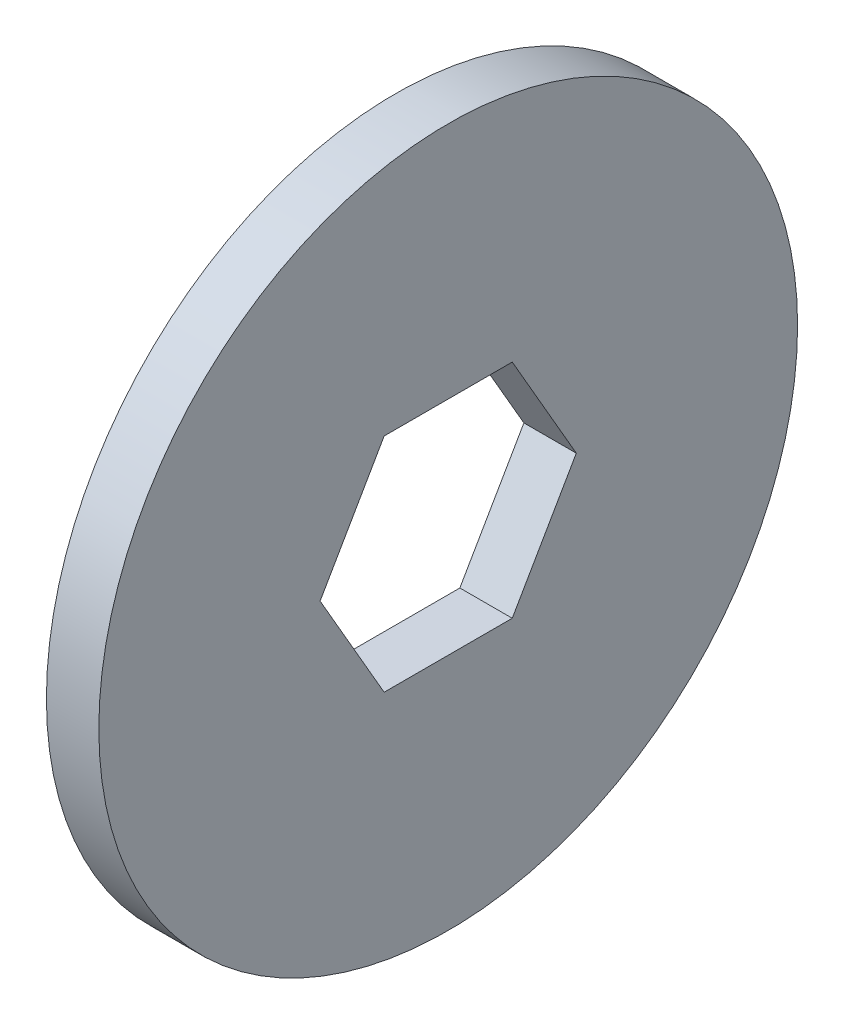
ISO-10303-21;
HEADER;
FILE_DESCRIPTION(('STEP AP214'),'2;1');
FILE_NAME('part.step','',(''),(''),'','','');
FILE_SCHEMA(('AUTOMOTIVE_DESIGN { 1 0 10303 214 1 1 1 1 }'));
ENDSEC;
DATA;
#1=APPLICATION_CONTEXT('core data for automotive mechanical design processes');
#2=APPLICATION_PROTOCOL_DEFINITION('international standard','automotive_design',2000,#1);
#3=PRODUCT_CONTEXT('',#1,'mechanical');
#4=PRODUCT('Part','Part','',(#3));
#5=PRODUCT_RELATED_PRODUCT_CATEGORY('part','',(#4));
#6=PRODUCT_DEFINITION_FORMATION('','',#4);
#7=PRODUCT_DEFINITION_CONTEXT('part definition',#1,'design');
#8=PRODUCT_DEFINITION('design','',#6,#7);
#9=PRODUCT_DEFINITION_SHAPE('','',#8);
#10=(LENGTH_UNIT() NAMED_UNIT(*) SI_UNIT(.MILLI.,.METRE.));
#11=(NAMED_UNIT(*) PLANE_ANGLE_UNIT() SI_UNIT($,.RADIAN.));
#12=(NAMED_UNIT(*) SI_UNIT($,.STERADIAN.) SOLID_ANGLE_UNIT());
#13=UNCERTAINTY_MEASURE_WITH_UNIT(LENGTH_MEASURE(1.E-05),#10,'distance_accuracy_value','');
#14=(GEOMETRIC_REPRESENTATION_CONTEXT(3) GLOBAL_UNCERTAINTY_ASSIGNED_CONTEXT((#13)) GLOBAL_UNIT_ASSIGNED_CONTEXT((#10,
#11,#12)) REPRESENTATION_CONTEXT('',''));
#15=CARTESIAN_POINT('',(0.,0.,0.));
#16=DIRECTION('',(0.,0.,1.));
#17=DIRECTION('',(1.,0.,0.));
#18=AXIS2_PLACEMENT_3D('',#15,#16,#17);
#19=CARTESIAN_POINT('',(3.,0.,0.));
#20=DIRECTION('',(1.,0.,0.));
#21=DIRECTION('',(0.,0.,-1.));
#22=AXIS2_PLACEMENT_3D('',#19,#20,#21);
#23=PLANE('',#22);
#24=CARTESIAN_POINT('',(3.,0.,0.));
#25=DIRECTION('',(1.,0.,0.));
#26=DIRECTION('',(0.,0.,-1.));
#27=AXIS2_PLACEMENT_3D('',#24,#25,#26);
#28=CIRCLE('',#27,20.);
#29=CARTESIAN_POINT('',(3.,0.,-20.));
#30=VERTEX_POINT('',#29);
#31=EDGE_CURVE('E11',#30,#30,#28,.T.);
#32=ORIENTED_EDGE('',*,*,#31,.T.);
#33=EDGE_LOOP('',(#32));
#34=FACE_BOUND('',#33,.T.);
#35=DIRECTION('',(0.,0.866025403784438,0.5));
#36=VECTOR('',#35,1.);
#37=CARTESIAN_POINT('',(3.,0.,-7.33234841870825));
#38=LINE('',#37,#36);
#39=CARTESIAN_POINT('',(3.,0.,-7.33234841870825));
#40=VERTEX_POINT('',#39);
#41=CARTESIAN_POINT('',(3.,6.35,-3.66617420935412));
#42=VERTEX_POINT('',#41);
#43=EDGE_CURVE('E106',#40,#42,#38,.T.);
#44=ORIENTED_EDGE('',*,*,#43,.F.);
#45=DIRECTION('',(0.,0.866025403784439,-0.5));
#46=VECTOR('',#45,1.);
#47=CARTESIAN_POINT('',(3.,-6.35,-3.66617420935413));
#48=LINE('',#47,#46);
#49=CARTESIAN_POINT('',(3.,-6.35,-3.66617420935413));
#50=VERTEX_POINT('',#49);
#51=EDGE_CURVE('E97',#50,#40,#48,.T.);
#52=ORIENTED_EDGE('',*,*,#51,.F.);
#53=DIRECTION('',(0.,0.,-1.));
#54=VECTOR('',#53,1.);
#55=CARTESIAN_POINT('',(3.,-6.35,3.66617420935412));
#56=LINE('',#55,#54);
#57=CARTESIAN_POINT('',(3.,-6.35,3.66617420935412));
#58=VERTEX_POINT('',#57);
#59=EDGE_CURVE('E131',#58,#50,#56,.T.);
#60=ORIENTED_EDGE('',*,*,#59,.F.);
#61=DIRECTION('',(0.,-0.866025403784439,-0.5));
#62=VECTOR('',#61,1.);
#63=CARTESIAN_POINT('',(3.,0.,7.33234841870825));
#64=LINE('',#63,#62);
#65=CARTESIAN_POINT('',(3.,0.,7.33234841870825));
#66=VERTEX_POINT('',#65);
#67=EDGE_CURVE('E128',#66,#58,#64,.T.);
#68=ORIENTED_EDGE('',*,*,#67,.F.);
#69=DIRECTION('',(0.,-0.866025403784438,0.5));
#70=VECTOR('',#69,1.);
#71=CARTESIAN_POINT('',(3.,6.35,3.66617420935412));
#72=LINE('',#71,#70);
#73=CARTESIAN_POINT('',(3.,6.35,3.66617420935412));
#74=VERTEX_POINT('',#73);
#75=EDGE_CURVE('E123',#74,#66,#72,.T.);
#76=ORIENTED_EDGE('',*,*,#75,.F.);
#77=DIRECTION('',(0.,0.,1.));
#78=VECTOR('',#77,1.);
#79=CARTESIAN_POINT('',(3.,6.35,-3.66617420935412));
#80=LINE('',#79,#78);
#81=EDGE_CURVE('E119',#42,#74,#80,.T.);
#82=ORIENTED_EDGE('',*,*,#81,.F.);
#83=EDGE_LOOP('',(#44,#52,#60,#68,#76,#82));
#84=FACE_BOUND('',#83,.T.);
#85=ADVANCED_FACE('F43',(#34,#84),#23,.T.);
#86=CARTESIAN_POINT('',(0.,0.,0.));
#87=DIRECTION('',(1.,0.,0.));
#88=DIRECTION('',(0.,0.,-1.));
#89=AXIS2_PLACEMENT_3D('',#86,#87,#88);
#90=PLANE('',#89);
#91=CARTESIAN_POINT('',(0.,0.,0.));
#92=DIRECTION('',(1.,0.,0.));
#93=DIRECTION('',(0.,0.,-1.));
#94=AXIS2_PLACEMENT_3D('',#91,#92,#93);
#95=CIRCLE('',#94,20.);
#96=CARTESIAN_POINT('',(0.,0.,-20.));
#97=VERTEX_POINT('',#96);
#98=EDGE_CURVE('E47',#97,#97,#95,.T.);
#99=ORIENTED_EDGE('',*,*,#98,.F.);
#100=EDGE_LOOP('',(#99));
#101=FACE_BOUND('',#100,.T.);
#102=DIRECTION('',(0.,0.866025403784439,-0.5));
#103=VECTOR('',#102,1.);
#104=CARTESIAN_POINT('',(0.,-6.35,-3.66617420935413));
#105=LINE('',#104,#103);
#106=CARTESIAN_POINT('',(0.,-6.35,-3.66617420935413));
#107=VERTEX_POINT('',#106);
#108=CARTESIAN_POINT('',(0.,0.,-7.33234841870825));
#109=VERTEX_POINT('',#108);
#110=EDGE_CURVE('E67',#107,#109,#105,.T.);
#111=ORIENTED_EDGE('',*,*,#110,.T.);
#112=DIRECTION('',(0.,0.866025403784438,0.5));
#113=VECTOR('',#112,1.);
#114=CARTESIAN_POINT('',(0.,0.,-7.33234841870825));
#115=LINE('',#114,#113);
#116=CARTESIAN_POINT('',(0.,6.35,-3.66617420935412));
#117=VERTEX_POINT('',#116);
#118=EDGE_CURVE('E113',#109,#117,#115,.T.);
#119=ORIENTED_EDGE('',*,*,#118,.T.);
#120=DIRECTION('',(0.,0.,1.));
#121=VECTOR('',#120,1.);
#122=CARTESIAN_POINT('',(0.,6.35,-3.66617420935412));
#123=LINE('',#122,#121);
#124=CARTESIAN_POINT('',(0.,6.35,3.66617420935412));
#125=VERTEX_POINT('',#124);
#126=EDGE_CURVE('E138',#117,#125,#123,.T.);
#127=ORIENTED_EDGE('',*,*,#126,.T.);
#128=DIRECTION('',(0.,-0.866025403784438,0.5));
#129=VECTOR('',#128,1.);
#130=CARTESIAN_POINT('',(0.,6.35,3.66617420935412));
#131=LINE('',#130,#129);
#132=CARTESIAN_POINT('',(0.,0.,7.33234841870825));
#133=VERTEX_POINT('',#132);
#134=EDGE_CURVE('E142',#125,#133,#131,.T.);
#135=ORIENTED_EDGE('',*,*,#134,.T.);
#136=DIRECTION('',(0.,-0.866025403784439,-0.5));
#137=VECTOR('',#136,1.);
#138=CARTESIAN_POINT('',(0.,0.,7.33234841870825));
#139=LINE('',#138,#137);
#140=CARTESIAN_POINT('',(0.,-6.35,3.66617420935412));
#141=VERTEX_POINT('',#140);
#142=EDGE_CURVE('E146',#133,#141,#139,.T.);
#143=ORIENTED_EDGE('',*,*,#142,.T.);
#144=DIRECTION('',(0.,0.,-1.));
#145=VECTOR('',#144,1.);
#146=CARTESIAN_POINT('',(0.,-6.35,3.66617420935412));
#147=LINE('',#146,#145);
#148=EDGE_CURVE('E107',#141,#107,#147,.T.);
#149=ORIENTED_EDGE('',*,*,#148,.T.);
#150=EDGE_LOOP('',(#111,#119,#127,#135,#143,#149));
#151=FACE_BOUND('',#150,.T.);
#152=ADVANCED_FACE('F170',(#101,#151),#90,.F.);
#153=CARTESIAN_POINT('',(3.,0.,0.));
#154=DIRECTION('',(-1.,0.,0.));
#155=DIRECTION('',(0.,0.,1.));
#156=AXIS2_PLACEMENT_3D('',#153,#154,#155);
#157=CYLINDRICAL_SURFACE('',#156,20.);
#158=ORIENTED_EDGE('',*,*,#31,.F.);
#159=EDGE_LOOP('',(#158));
#160=FACE_BOUND('',#159,.T.);
#161=ORIENTED_EDGE('',*,*,#98,.T.);
#162=EDGE_LOOP('',(#161));
#163=FACE_BOUND('',#162,.T.);
#164=ADVANCED_FACE('F45',(#160,#163),#157,.T.);
#165=CARTESIAN_POINT('',(3.,-6.35,-3.66617420935413));
#166=DIRECTION('',(0.,0.5,0.866025403784439));
#167=DIRECTION('',(0.,-0.866025403784439,0.5));
#168=AXIS2_PLACEMENT_3D('',#165,#166,#167);
#169=PLANE('',#168);
#170=ORIENTED_EDGE('',*,*,#110,.F.);
#171=DIRECTION('',(-1.,0.,0.));
#172=VECTOR('',#171,1.);
#173=CARTESIAN_POINT('',(3.,-6.35,-3.66617420935413));
#174=LINE('',#173,#172);
#175=EDGE_CURVE('E101',#50,#107,#174,.T.);
#176=ORIENTED_EDGE('',*,*,#175,.F.);
#177=ORIENTED_EDGE('',*,*,#51,.T.);
#178=DIRECTION('',(-1.,0.,0.));
#179=VECTOR('',#178,1.);
#180=CARTESIAN_POINT('',(3.,0.,-7.33234841870825));
#181=LINE('',#180,#179);
#182=EDGE_CURVE('E100',#40,#109,#181,.T.);
#183=ORIENTED_EDGE('',*,*,#182,.T.);
#184=EDGE_LOOP('',(#170,#176,#177,#183));
#185=FACE_BOUND('',#184,.T.);
#186=ADVANCED_FACE('F99',(#185),#169,.T.);
#187=CARTESIAN_POINT('',(3.,0.,-7.33234841870825));
#188=DIRECTION('',(0.,-0.5,0.866025403784438));
#189=DIRECTION('',(0.,-0.866025403784438,-0.5));
#190=AXIS2_PLACEMENT_3D('',#187,#188,#189);
#191=PLANE('',#190);
#192=ORIENTED_EDGE('',*,*,#118,.F.);
#193=ORIENTED_EDGE('',*,*,#182,.F.);
#194=ORIENTED_EDGE('',*,*,#43,.T.);
#195=DIRECTION('',(-1.,0.,0.));
#196=VECTOR('',#195,1.);
#197=CARTESIAN_POINT('',(3.,6.35,-3.66617420935412));
#198=LINE('',#197,#196);
#199=EDGE_CURVE('E115',#42,#117,#198,.T.);
#200=ORIENTED_EDGE('',*,*,#199,.T.);
#201=EDGE_LOOP('',(#192,#193,#194,#200));
#202=FACE_BOUND('',#201,.T.);
#203=ADVANCED_FACE('F110',(#202),#191,.T.);
#204=CARTESIAN_POINT('',(3.,6.35,-3.66617420935412));
#205=DIRECTION('',(0.,-1.,0.));
#206=DIRECTION('',(0.,0.,-1.));
#207=AXIS2_PLACEMENT_3D('',#204,#205,#206);
#208=PLANE('',#207);
#209=ORIENTED_EDGE('',*,*,#126,.F.);
#210=ORIENTED_EDGE('',*,*,#199,.F.);
#211=ORIENTED_EDGE('',*,*,#81,.T.);
#212=DIRECTION('',(-1.,0.,0.));
#213=VECTOR('',#212,1.);
#214=CARTESIAN_POINT('',(3.,6.35,3.66617420935412));
#215=LINE('',#214,#213);
#216=EDGE_CURVE('E160',#74,#125,#215,.T.);
#217=ORIENTED_EDGE('',*,*,#216,.T.);
#218=EDGE_LOOP('',(#209,#210,#211,#217));
#219=FACE_BOUND('',#218,.T.);
#220=ADVANCED_FACE('F166',(#219),#208,.T.);
#221=CARTESIAN_POINT('',(3.,6.35,3.66617420935412));
#222=DIRECTION('',(0.,-0.5,-0.866025403784439));
#223=DIRECTION('',(0.,0.866025403784439,-0.5));
#224=AXIS2_PLACEMENT_3D('',#221,#222,#223);
#225=PLANE('',#224);
#226=ORIENTED_EDGE('',*,*,#134,.F.);
#227=ORIENTED_EDGE('',*,*,#216,.F.);
#228=ORIENTED_EDGE('',*,*,#75,.T.);
#229=DIRECTION('',(-1.,0.,0.));
#230=VECTOR('',#229,1.);
#231=CARTESIAN_POINT('',(3.,0.,7.33234841870825));
#232=LINE('',#231,#230);
#233=EDGE_CURVE('E157',#66,#133,#232,.T.);
#234=ORIENTED_EDGE('',*,*,#233,.T.);
#235=EDGE_LOOP('',(#226,#227,#228,#234));
#236=FACE_BOUND('',#235,.T.);
#237=ADVANCED_FACE('F178',(#236),#225,.T.);
#238=CARTESIAN_POINT('',(3.,0.,7.33234841870825));
#239=DIRECTION('',(0.,0.5,-0.866025403784438));
#240=DIRECTION('',(0.,0.866025403784439,0.5));
#241=AXIS2_PLACEMENT_3D('',#238,#239,#240);
#242=PLANE('',#241);
#243=ORIENTED_EDGE('',*,*,#142,.F.);
#244=ORIENTED_EDGE('',*,*,#233,.F.);
#245=ORIENTED_EDGE('',*,*,#67,.T.);
#246=DIRECTION('',(-1.,0.,0.));
#247=VECTOR('',#246,1.);
#248=CARTESIAN_POINT('',(3.,-6.35,3.66617420935412));
#249=LINE('',#248,#247);
#250=EDGE_CURVE('E59',#58,#141,#249,.T.);
#251=ORIENTED_EDGE('',*,*,#250,.T.);
#252=EDGE_LOOP('',(#243,#244,#245,#251));
#253=FACE_BOUND('',#252,.T.);
#254=ADVANCED_FACE('F176',(#253),#242,.T.);
#255=CARTESIAN_POINT('',(3.,-6.35,3.66617420935412));
#256=DIRECTION('',(0.,1.,0.));
#257=DIRECTION('',(0.,0.,1.));
#258=AXIS2_PLACEMENT_3D('',#255,#256,#257);
#259=PLANE('',#258);
#260=ORIENTED_EDGE('',*,*,#148,.F.);
#261=ORIENTED_EDGE('',*,*,#250,.F.);
#262=ORIENTED_EDGE('',*,*,#59,.T.);
#263=ORIENTED_EDGE('',*,*,#175,.T.);
#264=EDGE_LOOP('',(#260,#261,#262,#263));
#265=FACE_BOUND('',#264,.T.);
#266=ADVANCED_FACE('F172',(#265),#259,.T.);
#267=CLOSED_SHELL('',(#85,#152,#164,#186,#203,#220,#237,#254,#266));
#268=MANIFOLD_SOLID_BREP('B2',#267);
#269=ADVANCED_BREP_SHAPE_REPRESENTATION('',(#18,#268),#14);
#270=SHAPE_DEFINITION_REPRESENTATION(#9,#269);
ENDSEC;
END-ISO-10303-21;
